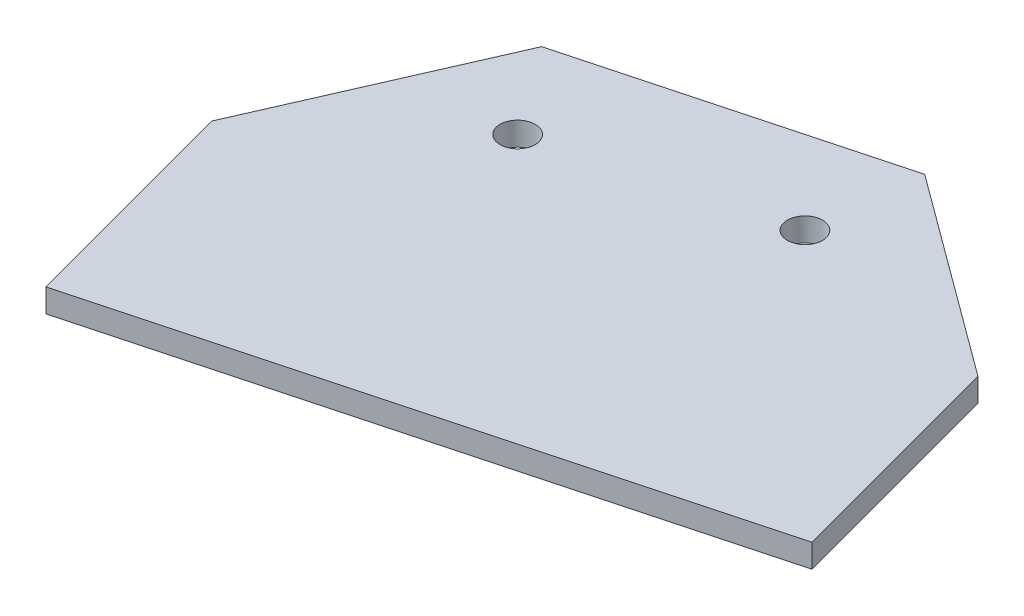
ISO-10303-21;
HEADER;
FILE_DESCRIPTION(('STEP AP214'),'2;1');
FILE_NAME('part.step','',(''),(''),'','','');
FILE_SCHEMA(('AUTOMOTIVE_DESIGN { 1 0 10303 214 1 1 1 1 }'));
ENDSEC;
DATA;
#1=APPLICATION_CONTEXT('core data for automotive mechanical design processes');
#2=APPLICATION_PROTOCOL_DEFINITION('international standard','automotive_design',2000,#1);
#3=PRODUCT_CONTEXT('',#1,'mechanical');
#4=PRODUCT('Part','Part','',(#3));
#5=PRODUCT_RELATED_PRODUCT_CATEGORY('part','',(#4));
#6=PRODUCT_DEFINITION_FORMATION('','',#4);
#7=PRODUCT_DEFINITION_CONTEXT('part definition',#1,'design');
#8=PRODUCT_DEFINITION('design','',#6,#7);
#9=PRODUCT_DEFINITION_SHAPE('','',#8);
#10=(LENGTH_UNIT() NAMED_UNIT(*) SI_UNIT(.MILLI.,.METRE.));
#11=(NAMED_UNIT(*) PLANE_ANGLE_UNIT() SI_UNIT($,.RADIAN.));
#12=(NAMED_UNIT(*) SI_UNIT($,.STERADIAN.) SOLID_ANGLE_UNIT());
#13=UNCERTAINTY_MEASURE_WITH_UNIT(LENGTH_MEASURE(1.E-05),#10,'distance_accuracy_value','');
#14=(GEOMETRIC_REPRESENTATION_CONTEXT(3) GLOBAL_UNCERTAINTY_ASSIGNED_CONTEXT((#13)) GLOBAL_UNIT_ASSIGNED_CONTEXT((#10,
#11,#12)) REPRESENTATION_CONTEXT('',''));
#15=CARTESIAN_POINT('',(0.,0.,0.));
#16=DIRECTION('',(0.,0.,1.));
#17=DIRECTION('',(1.,0.,0.));
#18=AXIS2_PLACEMENT_3D('',#15,#16,#17);
#19=CARTESIAN_POINT('',(-674.3540612755,-32.,2125.531357489));
#20=DIRECTION('',(0.,1.,0.));
#21=DIRECTION('',(1.,0.,0.));
#22=AXIS2_PLACEMENT_3D('',#19,#20,#21);
#23=PLANE('',#22);
#24=DIRECTION('',(0.258819045102985,0.,0.965925826288944));
#25=VECTOR('',#24,1.);
#26=CARTESIAN_POINT('',(-597.0799951723,-32.,2104.825833881));
#27=LINE('',#26,#25);
#28=CARTESIAN_POINT('',(-597.0799951723,-32.,2104.825833881));
#29=VERTEX_POINT('',#28);
#30=CARTESIAN_POINT('',(-595.5270809017,-32.,2110.621388839));
#31=VERTEX_POINT('',#30);
#32=EDGE_CURVE('E11',#29,#31,#27,.T.);
#33=ORIENTED_EDGE('',*,*,#32,.T.);
#34=DIRECTION('',(0.965925826288944,0.,-0.258819045102985));
#35=VECTOR('',#34,1.);
#36=CARTESIAN_POINT('',(-672.8011470049,-32.,2131.326912447));
#37=LINE('',#36,#35);
#38=CARTESIAN_POINT('',(-672.8011470049,-32.,2131.326912447));
#39=VERTEX_POINT('',#38);
#40=EDGE_CURVE('E21',#39,#31,#37,.T.);
#41=ORIENTED_EDGE('',*,*,#40,.F.);
#42=DIRECTION('',(0.258819045102985,0.,0.965925826288944));
#43=VECTOR('',#42,1.);
#44=CARTESIAN_POINT('',(-674.3540612755,-32.,2125.531357489));
#45=LINE('',#44,#43);
#46=CARTESIAN_POINT('',(-674.3540612755,-32.,2125.531357489));
#47=VERTEX_POINT('',#46);
#48=EDGE_CURVE('E190',#47,#39,#45,.T.);
#49=ORIENTED_EDGE('',*,*,#48,.F.);
#50=DIRECTION('',(0.965925826288944,0.,-0.258819045102985));
#51=VECTOR('',#50,1.);
#52=CARTESIAN_POINT('',(-674.3540612755,-32.,2125.531357489));
#53=LINE('',#52,#51);
#54=EDGE_CURVE('E135',#47,#29,#53,.T.);
#55=ORIENTED_EDGE('',*,*,#54,.T.);
#56=EDGE_LOOP('',(#33,#41,#49,#55));
#57=FACE_BOUND('',#56,.T.);
#58=ADVANCED_FACE('F17',(#57),#23,.F.);
#59=CARTESIAN_POINT('',(-597.0799951723,-32.,2104.825833881));
#60=DIRECTION('',(0.965925826288944,0.,-0.258819045102985));
#61=DIRECTION('',(0.,-1.,0.));
#62=AXIS2_PLACEMENT_3D('',#59,#60,#61);
#63=PLANE('',#62);
#64=ORIENTED_EDGE('',*,*,#32,.F.);
#65=DIRECTION('',(0.,1.,0.));
#66=VECTOR('',#65,1.);
#67=CARTESIAN_POINT('',(-597.0799951723,-32.,2104.825833881));
#68=LINE('',#67,#66);
#69=CARTESIAN_POINT('',(-597.0799951723,-26.,2104.825833881));
#70=VERTEX_POINT('',#69);
#71=EDGE_CURVE('E127',#29,#70,#68,.T.);
#72=ORIENTED_EDGE('',*,*,#71,.T.);
#73=DIRECTION('',(0.258819045102985,0.,0.965925826288944));
#74=VECTOR('',#73,1.);
#75=CARTESIAN_POINT('',(-597.0799951723,-26.,2104.825833881));
#76=LINE('',#75,#74);
#77=CARTESIAN_POINT('',(-595.5270809017,-26.,2110.621388839));
#78=VERTEX_POINT('',#77);
#79=EDGE_CURVE('E130',#70,#78,#76,.T.);
#80=ORIENTED_EDGE('',*,*,#79,.T.);
#81=DIRECTION('',(0.,1.,0.));
#82=VECTOR('',#81,1.);
#83=CARTESIAN_POINT('',(-595.5270809017,-32.,2110.621388839));
#84=LINE('',#83,#82);
#85=EDGE_CURVE('E27',#31,#78,#84,.T.);
#86=ORIENTED_EDGE('',*,*,#85,.F.);
#87=EDGE_LOOP('',(#64,#72,#80,#86));
#88=FACE_BOUND('',#87,.T.);
#89=ADVANCED_FACE('F19',(#88),#63,.T.);
#90=CARTESIAN_POINT('',(-672.8011470049,-32.,2131.326912447));
#91=DIRECTION('',(0.258819045102985,0.,0.965925826288944));
#92=DIRECTION('',(0.,-1.,0.));
#93=AXIS2_PLACEMENT_3D('',#90,#91,#92);
#94=PLANE('',#93);
#95=DIRECTION('',(0.,1.,0.));
#96=VECTOR('',#95,1.);
#97=CARTESIAN_POINT('',(-672.8011470049,-32.,2131.326912447));
#98=LINE('',#97,#96);
#99=CARTESIAN_POINT('',(-672.8011470049,-26.,2131.326912447));
#100=VERTEX_POINT('',#99);
#101=EDGE_CURVE('E188',#39,#100,#98,.T.);
#102=ORIENTED_EDGE('',*,*,#101,.F.);
#103=ORIENTED_EDGE('',*,*,#40,.T.);
#104=ORIENTED_EDGE('',*,*,#85,.T.);
#105=DIRECTION('',(0.965925826288944,0.,-0.258819045102985));
#106=VECTOR('',#105,1.);
#107=CARTESIAN_POINT('',(-672.8011470049,-26.,2131.326912447));
#108=LINE('',#107,#106);
#109=EDGE_CURVE('E162',#100,#78,#108,.T.);
#110=ORIENTED_EDGE('',*,*,#109,.F.);
#111=EDGE_LOOP('',(#102,#103,#104,#110));
#112=FACE_BOUND('',#111,.T.);
#113=ADVANCED_FACE('F253',(#112),#94,.T.);
#114=CARTESIAN_POINT('',(-674.3540612755,-32.,2125.531357489));
#115=DIRECTION('',(0.965925826288944,0.,-0.258819045102985));
#116=DIRECTION('',(0.,-1.,0.));
#117=AXIS2_PLACEMENT_3D('',#114,#115,#116);
#118=PLANE('',#117);
#119=ORIENTED_EDGE('',*,*,#101,.T.);
#120=DIRECTION('',(0.258819045102985,0.,0.965925826288944));
#121=VECTOR('',#120,1.);
#122=CARTESIAN_POINT('',(-674.3540612755,-26.,2125.531357489));
#123=LINE('',#122,#121);
#124=CARTESIAN_POINT('',(-674.3540612755,-26.,2125.531357489));
#125=VERTEX_POINT('',#124);
#126=EDGE_CURVE('E167',#125,#100,#123,.T.);
#127=ORIENTED_EDGE('',*,*,#126,.F.);
#128=DIRECTION('',(0.,1.,0.));
#129=VECTOR('',#128,1.);
#130=CARTESIAN_POINT('',(-674.3540612755,-32.,2125.531357489));
#131=LINE('',#130,#129);
#132=EDGE_CURVE('E180',#47,#125,#131,.T.);
#133=ORIENTED_EDGE('',*,*,#132,.F.);
#134=ORIENTED_EDGE('',*,*,#48,.T.);
#135=EDGE_LOOP('',(#119,#127,#133,#134));
#136=FACE_BOUND('',#135,.T.);
#137=ADVANCED_FACE('F245',(#136),#118,.F.);
#138=CARTESIAN_POINT('',(-600.0099582626,-19.99,2132.528095816));
#139=DIRECTION('',(0.,1.,0.));
#140=DIRECTION('',(0.965925826288944,0.,-0.258819045102985));
#141=AXIS2_PLACEMENT_3D('',#138,#139,#140);
#142=CYLINDRICAL_SURFACE('',#141,4.5);
#143=CARTESIAN_POINT('',(-600.0099582626,-20.,2132.528095816));
#144=DIRECTION('',(0.,1.,0.));
#145=DIRECTION('',(0.965925826288944,0.,-0.258819045102985));
#146=AXIS2_PLACEMENT_3D('',#143,#144,#145);
#147=CIRCLE('',#146,4.5);
#148=CARTESIAN_POINT('',(-595.6632920443,-20.,2131.363410113));
#149=VERTEX_POINT('',#148);
#150=EDGE_CURVE('E209',#149,#149,#147,.T.);
#151=ORIENTED_EDGE('',*,*,#150,.T.);
#152=DIRECTION('',(0.,-1.,0.));
#153=VECTOR('',#152,1.);
#154=CARTESIAN_POINT('',(-595.6632920443,-19.99,2131.363410113));
#155=LINE('',#154,#153);
#156=CARTESIAN_POINT('',(-595.6632920443,-26.,2131.363410113));
#157=VERTEX_POINT('',#156);
#158=EDGE_CURVE('E186',#149,#157,#155,.T.);
#159=ORIENTED_EDGE('',*,*,#158,.T.);
#160=CARTESIAN_POINT('',(-600.0099582626,-26.,2132.528095816));
#161=DIRECTION('',(0.,1.,0.));
#162=DIRECTION('',(0.965925826288944,0.,-0.258819045102985));
#163=AXIS2_PLACEMENT_3D('',#160,#161,#162);
#164=CIRCLE('',#163,4.5);
#165=EDGE_CURVE('E171',#157,#157,#164,.T.);
#166=ORIENTED_EDGE('',*,*,#165,.F.);
#167=ORIENTED_EDGE('',*,*,#158,.F.);
#168=EDGE_LOOP('',(#151,#159,#166,#167));
#169=FACE_BOUND('',#168,.T.);
#170=ADVANCED_FACE('F262',(#169),#142,.F.);
#171=CARTESIAN_POINT('',(-657.9655078399,-19.99,2148.057238522));
#172=DIRECTION('',(0.,1.,0.));
#173=DIRECTION('',(0.965925826288944,0.,-0.258819045102985));
#174=AXIS2_PLACEMENT_3D('',#171,#172,#173);
#175=CYLINDRICAL_SURFACE('',#174,4.5);
#176=CARTESIAN_POINT('',(-657.9655078399,-20.,2148.057238522));
#177=DIRECTION('',(0.,1.,0.));
#178=DIRECTION('',(0.965925826288944,0.,-0.258819045102985));
#179=AXIS2_PLACEMENT_3D('',#176,#177,#178);
#180=CIRCLE('',#179,4.5);
#181=CARTESIAN_POINT('',(-653.6188416216,-20.,2146.892552819));
#182=VERTEX_POINT('',#181);
#183=EDGE_CURVE('E206',#182,#182,#180,.T.);
#184=ORIENTED_EDGE('',*,*,#183,.T.);
#185=DIRECTION('',(0.,-1.,0.));
#186=VECTOR('',#185,1.);
#187=CARTESIAN_POINT('',(-653.6188416216,-19.99,2146.892552819));
#188=LINE('',#187,#186);
#189=CARTESIAN_POINT('',(-653.6188416216,-26.,2146.892552819));
#190=VERTEX_POINT('',#189);
#191=EDGE_CURVE('E183',#182,#190,#188,.T.);
#192=ORIENTED_EDGE('',*,*,#191,.T.);
#193=CARTESIAN_POINT('',(-657.9655078399,-26.,2148.057238522));
#194=DIRECTION('',(0.,1.,0.));
#195=DIRECTION('',(0.965925826288944,0.,-0.258819045102985));
#196=AXIS2_PLACEMENT_3D('',#193,#194,#195);
#197=CIRCLE('',#196,4.5);
#198=EDGE_CURVE('E156',#190,#190,#197,.T.);
#199=ORIENTED_EDGE('',*,*,#198,.F.);
#200=ORIENTED_EDGE('',*,*,#191,.F.);
#201=EDGE_LOOP('',(#184,#192,#199,#200));
#202=FACE_BOUND('',#201,.T.);
#203=ADVANCED_FACE('F259',(#202),#175,.F.);
#204=CARTESIAN_POINT('',(-597.0799951723,-20.,2104.825833881));
#205=DIRECTION('',(-0.258819045102985,0.,-0.965925826288944));
#206=DIRECTION('',(-0.965925826288944,0.,0.258819045102985));
#207=AXIS2_PLACEMENT_3D('',#204,#205,#206);
#208=PLANE('',#207);
#209=DIRECTION('',(0.,-1.,0.));
#210=VECTOR('',#209,1.);
#211=CARTESIAN_POINT('',(-597.0799951723,-20.,2104.825833881));
#212=LINE('',#211,#210);
#213=CARTESIAN_POINT('',(-597.0799951723,-20.,2104.825833881));
#214=VERTEX_POINT('',#213);
#215=EDGE_CURVE('E136',#214,#70,#212,.T.);
#216=ORIENTED_EDGE('',*,*,#215,.T.);
#217=ORIENTED_EDGE('',*,*,#71,.F.);
#218=ORIENTED_EDGE('',*,*,#54,.F.);
#219=ORIENTED_EDGE('',*,*,#132,.T.);
#220=DIRECTION('',(0.,-1.,0.));
#221=VECTOR('',#220,1.);
#222=CARTESIAN_POINT('',(-674.3540612755,-20.,2125.531357489));
#223=LINE('',#222,#221);
#224=CARTESIAN_POINT('',(-674.3540612755,-20.,2125.531357489));
#225=VERTEX_POINT('',#224);
#226=EDGE_CURVE('E146',#225,#125,#223,.T.);
#227=ORIENTED_EDGE('',*,*,#226,.F.);
#228=DIRECTION('',(-0.965925826288944,0.,0.258819045102985));
#229=VECTOR('',#228,1.);
#230=CARTESIAN_POINT('',(-597.0799951723,-20.,2104.825833881));
#231=LINE('',#230,#229);
#232=EDGE_CURVE('E142',#214,#225,#231,.T.);
#233=ORIENTED_EDGE('',*,*,#232,.F.);
#234=EDGE_LOOP('',(#216,#217,#218,#219,#227,#233));
#235=FACE_BOUND('',#234,.T.);
#236=ADVANCED_FACE('F140',(#235),#208,.T.);
#237=CARTESIAN_POINT('',(-545.5020098657,-20.,2142.769363392));
#238=DIRECTION('',(0.592578374296149,0.,-0.805512799598202));
#239=DIRECTION('',(0.,-1.,0.));
#240=AXIS2_PLACEMENT_3D('',#237,#238,#239);
#241=PLANE('',#240);
#242=DIRECTION('',(0.,-1.,0.));
#243=VECTOR('',#242,1.);
#244=CARTESIAN_POINT('',(-545.5020098657,-20.,2142.769363392));
#245=LINE('',#244,#243);
#246=CARTESIAN_POINT('',(-545.5020098657,-20.,2142.769363392));
#247=VERTEX_POINT('',#246);
#248=CARTESIAN_POINT('',(-545.5020098657,-26.,2142.769363392));
#249=VERTEX_POINT('',#248);
#250=EDGE_CURVE('E152',#247,#249,#245,.T.);
#251=ORIENTED_EDGE('',*,*,#250,.T.);
#252=DIRECTION('',(-0.805512799598202,0.,-0.592578374296149));
#253=VECTOR('',#252,1.);
#254=CARTESIAN_POINT('',(-545.5020098657,-26.,2142.769363392));
#255=LINE('',#254,#253);
#256=EDGE_CURVE('E149',#249,#70,#255,.T.);
#257=ORIENTED_EDGE('',*,*,#256,.T.);
#258=ORIENTED_EDGE('',*,*,#215,.F.);
#259=DIRECTION('',(-0.805512799598202,0.,-0.592578374296149));
#260=VECTOR('',#259,1.);
#261=CARTESIAN_POINT('',(-545.5020098657,-20.,2142.769363392));
#262=LINE('',#261,#260);
#263=EDGE_CURVE('E232',#247,#214,#262,.T.);
#264=ORIENTED_EDGE('',*,*,#263,.F.);
#265=EDGE_LOOP('',(#251,#257,#258,#264));
#266=FACE_BOUND('',#265,.T.);
#267=ADVANCED_FACE('F150',(#266),#241,.T.);
#268=CARTESIAN_POINT('',(-674.3540612755,-20.,2125.531357489));
#269=DIRECTION('',(-0.915944325673055,0.,-0.401305360377024));
#270=DIRECTION('',(-0.401305360377024,0.,0.915944325673055));
#271=AXIS2_PLACEMENT_3D('',#268,#269,#270);
#272=PLANE('',#271);
#273=ORIENTED_EDGE('',*,*,#226,.T.);
#274=DIRECTION('',(-0.401305360377024,0.,0.915944325673055));
#275=VECTOR('',#274,1.);
#276=CARTESIAN_POINT('',(-674.3540612755,-26.,2125.531357489));
#277=LINE('',#276,#275);
#278=CARTESIAN_POINT('',(-700.0501420719,-26.,2184.180410608));
#279=VERTEX_POINT('',#278);
#280=EDGE_CURVE('E240',#125,#279,#277,.T.);
#281=ORIENTED_EDGE('',*,*,#280,.T.);
#282=DIRECTION('',(0.,-1.,0.));
#283=VECTOR('',#282,1.);
#284=CARTESIAN_POINT('',(-700.0501420719,-20.,2184.180410608));
#285=LINE('',#284,#283);
#286=CARTESIAN_POINT('',(-700.0501420719,-20.,2184.180410608));
#287=VERTEX_POINT('',#286);
#288=EDGE_CURVE('E214',#287,#279,#285,.T.);
#289=ORIENTED_EDGE('',*,*,#288,.F.);
#290=DIRECTION('',(-0.401305360377024,0.,0.915944325673055));
#291=VECTOR('',#290,1.);
#292=CARTESIAN_POINT('',(-674.3540612755,-20.,2125.531357489));
#293=LINE('',#292,#291);
#294=EDGE_CURVE('E210',#225,#287,#293,.T.);
#295=ORIENTED_EDGE('',*,*,#294,.F.);
#296=EDGE_LOOP('',(#273,#281,#289,#295));
#297=FACE_BOUND('',#296,.T.);
#298=ADVANCED_FACE('F306',(#297),#272,.T.);
#299=CARTESIAN_POINT('',(-619.5951103895,-26.,2175.346412159));
#300=DIRECTION('',(0.,1.,0.));
#301=DIRECTION('',(1.,0.,0.));
#302=AXIS2_PLACEMENT_3D('',#299,#300,#301);
#303=PLANE('',#302);
#304=ORIENTED_EDGE('',*,*,#165,.T.);
#305=EDGE_LOOP('',(#304));
#306=FACE_BOUND('',#305,.T.);
#307=ORIENTED_EDGE('',*,*,#198,.T.);
#308=EDGE_LOOP('',(#307));
#309=FACE_BOUND('',#308,.T.);
#310=ORIENTED_EDGE('',*,*,#280,.F.);
#311=ORIENTED_EDGE('',*,*,#126,.T.);
#312=ORIENTED_EDGE('',*,*,#109,.T.);
#313=ORIENTED_EDGE('',*,*,#79,.F.);
#314=ORIENTED_EDGE('',*,*,#256,.F.);
#315=DIRECTION('',(-0.258819045102985,0.,-0.965925826288944));
#316=VECTOR('',#315,1.);
#317=CARTESIAN_POINT('',(-529.9728671595,-26.,2200.724912969));
#318=LINE('',#317,#316);
#319=CARTESIAN_POINT('',(-529.9728671595,-26.,2200.724912969));
#320=VERTEX_POINT('',#319);
#321=EDGE_CURVE('E222',#320,#249,#318,.T.);
#322=ORIENTED_EDGE('',*,*,#321,.F.);
#323=DIRECTION('',(0.965925826288944,0.,-0.258819045102985));
#324=VECTOR('',#323,1.);
#325=CARTESIAN_POINT('',(-684.5209993658,-26.,2242.135960185));
#326=LINE('',#325,#324);
#327=CARTESIAN_POINT('',(-684.5209993658,-26.,2242.135960185));
#328=VERTEX_POINT('',#327);
#329=EDGE_CURVE('E388',#328,#320,#326,.T.);
#330=ORIENTED_EDGE('',*,*,#329,.F.);
#331=DIRECTION('',(0.258819045102985,0.,0.965925826288944));
#332=VECTOR('',#331,1.);
#333=CARTESIAN_POINT('',(-700.0501420719,-26.,2184.180410608));
#334=LINE('',#333,#332);
#335=EDGE_CURVE('E223',#279,#328,#334,.T.);
#336=ORIENTED_EDGE('',*,*,#335,.F.);
#337=EDGE_LOOP('',(#310,#311,#312,#313,#314,#322,#330,#336));
#338=FACE_BOUND('',#337,.T.);
#339=ADVANCED_FACE('F159',(#306,#309,#338),#303,.F.);
#340=CARTESIAN_POINT('',(-619.5951103895,-20.,2175.346412159));
#341=DIRECTION('',(0.,1.,0.));
#342=DIRECTION('',(1.,0.,0.));
#343=AXIS2_PLACEMENT_3D('',#340,#341,#342);
#344=PLANE('',#343);
#345=ORIENTED_EDGE('',*,*,#150,.F.);
#346=EDGE_LOOP('',(#345));
#347=FACE_BOUND('',#346,.T.);
#348=ORIENTED_EDGE('',*,*,#183,.F.);
#349=EDGE_LOOP('',(#348));
#350=FACE_BOUND('',#349,.T.);
#351=DIRECTION('',(0.965925826288944,0.,-0.258819045102985));
#352=VECTOR('',#351,1.);
#353=CARTESIAN_POINT('',(-684.5209993658,-20.,2242.135960185));
#354=LINE('',#353,#352);
#355=CARTESIAN_POINT('',(-684.5209993658,-20.,2242.135960185));
#356=VERTEX_POINT('',#355);
#357=CARTESIAN_POINT('',(-529.9728671595,-20.,2200.724912969));
#358=VERTEX_POINT('',#357);
#359=EDGE_CURVE('E211',#356,#358,#354,.T.);
#360=ORIENTED_EDGE('',*,*,#359,.T.);
#361=DIRECTION('',(-0.258819045102985,0.,-0.965925826288944));
#362=VECTOR('',#361,1.);
#363=CARTESIAN_POINT('',(-529.9728671595,-20.,2200.724912969));
#364=LINE('',#363,#362);
#365=EDGE_CURVE('E228',#358,#247,#364,.T.);
#366=ORIENTED_EDGE('',*,*,#365,.T.);
#367=ORIENTED_EDGE('',*,*,#263,.T.);
#368=ORIENTED_EDGE('',*,*,#232,.T.);
#369=ORIENTED_EDGE('',*,*,#294,.T.);
#370=DIRECTION('',(0.258819045102985,0.,0.965925826288944));
#371=VECTOR('',#370,1.);
#372=CARTESIAN_POINT('',(-700.0501420719,-20.,2184.180410608));
#373=LINE('',#372,#371);
#374=EDGE_CURVE('E219',#287,#356,#373,.T.);
#375=ORIENTED_EDGE('',*,*,#374,.T.);
#376=EDGE_LOOP('',(#360,#366,#367,#368,#369,#375));
#377=FACE_BOUND('',#376,.T.);
#378=ADVANCED_FACE('F320',(#347,#350,#377),#344,.T.);
#379=CARTESIAN_POINT('',(-529.9728671595,-20.,2200.724912969));
#380=DIRECTION('',(0.965925826288944,0.,-0.258819045102985));
#381=DIRECTION('',(0.,-1.,0.));
#382=AXIS2_PLACEMENT_3D('',#379,#380,#381);
#383=PLANE('',#382);
#384=DIRECTION('',(0.,-1.,0.));
#385=VECTOR('',#384,1.);
#386=CARTESIAN_POINT('',(-529.9728671595,-20.,2200.724912969));
#387=LINE('',#386,#385);
#388=EDGE_CURVE('E204',#358,#320,#387,.T.);
#389=ORIENTED_EDGE('',*,*,#388,.T.);
#390=ORIENTED_EDGE('',*,*,#321,.T.);
#391=ORIENTED_EDGE('',*,*,#250,.F.);
#392=ORIENTED_EDGE('',*,*,#365,.F.);
#393=EDGE_LOOP('',(#389,#390,#391,#392));
#394=FACE_BOUND('',#393,.T.);
#395=ADVANCED_FACE('F329',(#394),#383,.T.);
#396=CARTESIAN_POINT('',(-700.0501420719,-20.,2184.180410608));
#397=DIRECTION('',(-0.965925826288944,0.,0.258819045102985));
#398=DIRECTION('',(0.,1.,0.));
#399=AXIS2_PLACEMENT_3D('',#396,#397,#398);
#400=PLANE('',#399);
#401=ORIENTED_EDGE('',*,*,#288,.T.);
#402=ORIENTED_EDGE('',*,*,#335,.T.);
#403=DIRECTION('',(0.,-1.,0.));
#404=VECTOR('',#403,1.);
#405=CARTESIAN_POINT('',(-684.5209993658,-20.,2242.135960185));
#406=LINE('',#405,#404);
#407=EDGE_CURVE('E385',#356,#328,#406,.T.);
#408=ORIENTED_EDGE('',*,*,#407,.F.);
#409=ORIENTED_EDGE('',*,*,#374,.F.);
#410=EDGE_LOOP('',(#401,#402,#408,#409));
#411=FACE_BOUND('',#410,.T.);
#412=ADVANCED_FACE('F338',(#411),#400,.T.);
#413=CARTESIAN_POINT('',(-684.5209993658,-20.,2242.135960185));
#414=DIRECTION('',(0.258819045102985,0.,0.965925826288944));
#415=DIRECTION('',(0.,-1.,0.));
#416=AXIS2_PLACEMENT_3D('',#413,#414,#415);
#417=PLANE('',#416);
#418=ORIENTED_EDGE('',*,*,#407,.T.);
#419=ORIENTED_EDGE('',*,*,#329,.T.);
#420=ORIENTED_EDGE('',*,*,#388,.F.);
#421=ORIENTED_EDGE('',*,*,#359,.F.);
#422=EDGE_LOOP('',(#418,#419,#420,#421));
#423=FACE_BOUND('',#422,.T.);
#424=ADVANCED_FACE('F347',(#423),#417,.T.);
#425=CLOSED_SHELL('',(#58,#89,#113,#137,#170,#203,#236,#267,#298,#339,#378,#395,#412,#424));
#426=MANIFOLD_SOLID_BREP('B1',#425);
#427=ADVANCED_BREP_SHAPE_REPRESENTATION('',(#18,#426),#14);
#428=SHAPE_DEFINITION_REPRESENTATION(#9,#427);
ENDSEC;
END-ISO-10303-21;
